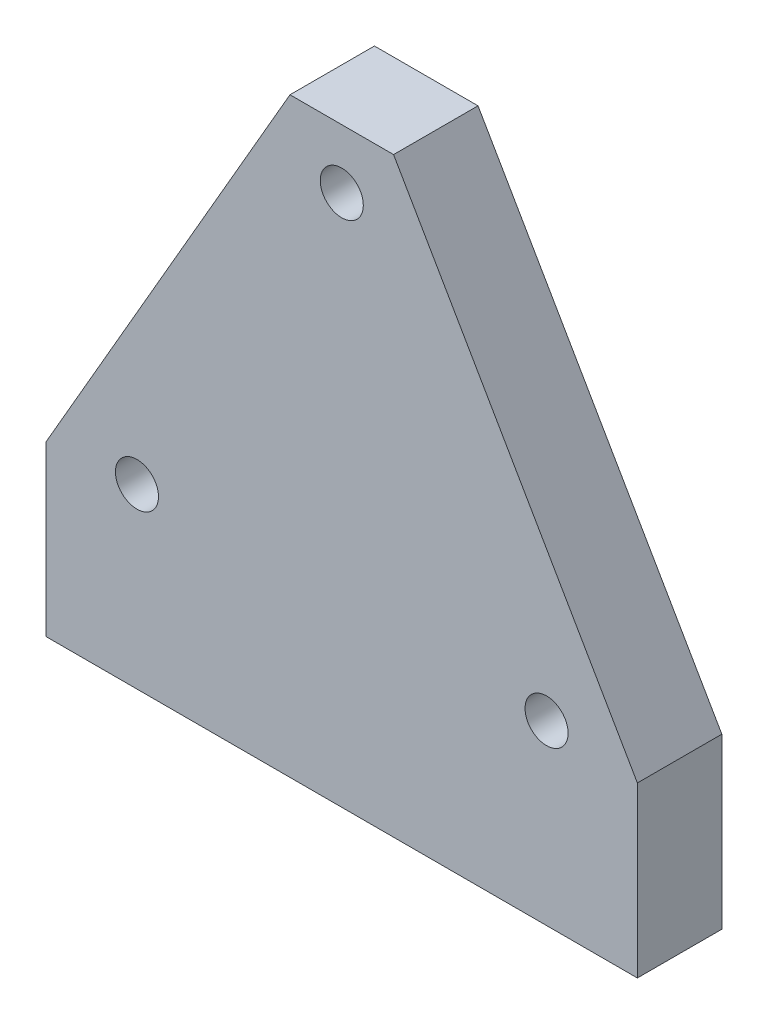
ISO-10303-21;
HEADER;
FILE_DESCRIPTION(('STEP AP214'),'2;1');
FILE_NAME('part.step','',(''),(''),'','','');
FILE_SCHEMA(('AUTOMOTIVE_DESIGN { 1 0 10303 214 1 1 1 1 }'));
ENDSEC;
DATA;
#1=APPLICATION_CONTEXT('core data for automotive mechanical design processes');
#2=APPLICATION_PROTOCOL_DEFINITION('international standard','automotive_design',2000,#1);
#3=PRODUCT_CONTEXT('',#1,'mechanical');
#4=PRODUCT('Part','Part','',(#3));
#5=PRODUCT_RELATED_PRODUCT_CATEGORY('part','',(#4));
#6=PRODUCT_DEFINITION_FORMATION('','',#4);
#7=PRODUCT_DEFINITION_CONTEXT('part definition',#1,'design');
#8=PRODUCT_DEFINITION('design','',#6,#7);
#9=PRODUCT_DEFINITION_SHAPE('','',#8);
#10=(LENGTH_UNIT() NAMED_UNIT(*) SI_UNIT(.MILLI.,.METRE.));
#11=(NAMED_UNIT(*) PLANE_ANGLE_UNIT() SI_UNIT($,.RADIAN.));
#12=(NAMED_UNIT(*) SI_UNIT($,.STERADIAN.) SOLID_ANGLE_UNIT());
#13=UNCERTAINTY_MEASURE_WITH_UNIT(LENGTH_MEASURE(1.E-05),#10,'distance_accuracy_value','');
#14=(GEOMETRIC_REPRESENTATION_CONTEXT(3) GLOBAL_UNCERTAINTY_ASSIGNED_CONTEXT((#13)) GLOBAL_UNIT_ASSIGNED_CONTEXT((#10,
#11,#12)) REPRESENTATION_CONTEXT('',''));
#15=CARTESIAN_POINT('',(0.,0.,0.));
#16=DIRECTION('',(0.,0.,1.));
#17=DIRECTION('',(1.,0.,0.));
#18=AXIS2_PLACEMENT_3D('',#15,#16,#17);
#19=CARTESIAN_POINT('',(0.,0.,10.));
#20=DIRECTION('',(1.,0.,0.));
#21=DIRECTION('',(0.,0.,-1.));
#22=AXIS2_PLACEMENT_3D('',#19,#20,#21);
#23=PLANE('',#22);
#24=DIRECTION('',(0.,-1.,0.));
#25=VECTOR('',#24,1.);
#26=CARTESIAN_POINT('',(0.,0.,10.));
#27=LINE('',#26,#25);
#28=CARTESIAN_POINT('',(0.,19.9999999999997,10.));
#29=VERTEX_POINT('',#28);
#30=CARTESIAN_POINT('',(0.,0.,10.));
#31=VERTEX_POINT('',#30);
#32=EDGE_CURVE('E99',#29,#31,#27,.T.);
#33=ORIENTED_EDGE('',*,*,#32,.F.);
#34=DIRECTION('',(0.,0.,-1.));
#35=VECTOR('',#34,1.);
#36=CARTESIAN_POINT('',(0.,19.9999999999997,10.));
#37=LINE('',#36,#35);
#38=CARTESIAN_POINT('',(0.,19.9999999999997,0.));
#39=VERTEX_POINT('',#38);
#40=EDGE_CURVE('E145',#29,#39,#37,.T.);
#41=ORIENTED_EDGE('',*,*,#40,.T.);
#42=DIRECTION('',(0.,-1.,0.));
#43=VECTOR('',#42,1.);
#44=CARTESIAN_POINT('',(0.,0.,0.));
#45=LINE('',#44,#43);
#46=CARTESIAN_POINT('',(0.,0.,0.));
#47=VERTEX_POINT('',#46);
#48=EDGE_CURVE('E123',#39,#47,#45,.T.);
#49=ORIENTED_EDGE('',*,*,#48,.T.);
#50=DIRECTION('',(0.,0.,-1.));
#51=VECTOR('',#50,1.);
#52=CARTESIAN_POINT('',(0.,0.,10.));
#53=LINE('',#52,#51);
#54=EDGE_CURVE('E116',#31,#47,#53,.T.);
#55=ORIENTED_EDGE('',*,*,#54,.F.);
#56=EDGE_LOOP('',(#33,#41,#49,#55));
#57=FACE_BOUND('',#56,.T.);
#58=ADVANCED_FACE('F45',(#57),#23,.F.);
#59=CARTESIAN_POINT('',(0.,0.,10.));
#60=DIRECTION('',(0.,1.,0.));
#61=DIRECTION('',(0.,0.,1.));
#62=AXIS2_PLACEMENT_3D('',#59,#60,#61);
#63=PLANE('',#62);
#64=DIRECTION('',(1.,0.,0.));
#65=VECTOR('',#64,1.);
#66=CARTESIAN_POINT('',(0.,0.,0.));
#67=LINE('',#66,#65);
#68=CARTESIAN_POINT('',(70.,0.,0.));
#69=VERTEX_POINT('',#68);
#70=EDGE_CURVE('E153',#47,#69,#67,.T.);
#71=ORIENTED_EDGE('',*,*,#70,.T.);
#72=DIRECTION('',(0.,0.,-1.));
#73=VECTOR('',#72,1.);
#74=CARTESIAN_POINT('',(70.,0.,10.));
#75=LINE('',#74,#73);
#76=CARTESIAN_POINT('',(70.,0.,10.));
#77=VERTEX_POINT('',#76);
#78=EDGE_CURVE('E118',#77,#69,#75,.T.);
#79=ORIENTED_EDGE('',*,*,#78,.F.);
#80=DIRECTION('',(1.,0.,0.));
#81=VECTOR('',#80,1.);
#82=CARTESIAN_POINT('',(0.,0.,10.));
#83=LINE('',#82,#81);
#84=EDGE_CURVE('E103',#31,#77,#83,.T.);
#85=ORIENTED_EDGE('',*,*,#84,.F.);
#86=ORIENTED_EDGE('',*,*,#54,.T.);
#87=EDGE_LOOP('',(#71,#79,#85,#86));
#88=FACE_BOUND('',#87,.T.);
#89=ADVANCED_FACE('F115',(#88),#63,.F.);
#90=CARTESIAN_POINT('',(70.,0.,10.));
#91=DIRECTION('',(-1.,0.,0.));
#92=DIRECTION('',(0.,0.,1.));
#93=AXIS2_PLACEMENT_3D('',#90,#91,#92);
#94=PLANE('',#93);
#95=DIRECTION('',(0.,1.,0.));
#96=VECTOR('',#95,1.);
#97=CARTESIAN_POINT('',(70.,0.,0.));
#98=LINE('',#97,#96);
#99=CARTESIAN_POINT('',(70.,19.9999999999997,0.));
#100=VERTEX_POINT('',#99);
#101=EDGE_CURVE('E159',#69,#100,#98,.T.);
#102=ORIENTED_EDGE('',*,*,#101,.T.);
#103=DIRECTION('',(0.,0.,1.));
#104=VECTOR('',#103,1.);
#105=CARTESIAN_POINT('',(70.,19.9999999999997,10.));
#106=LINE('',#105,#104);
#107=CARTESIAN_POINT('',(70.,19.9999999999997,10.));
#108=VERTEX_POINT('',#107);
#109=EDGE_CURVE('E139',#100,#108,#106,.T.);
#110=ORIENTED_EDGE('',*,*,#109,.T.);
#111=DIRECTION('',(0.,1.,0.));
#112=VECTOR('',#111,1.);
#113=CARTESIAN_POINT('',(70.,0.,10.));
#114=LINE('',#113,#112);
#115=EDGE_CURVE('E121',#77,#108,#114,.T.);
#116=ORIENTED_EDGE('',*,*,#115,.F.);
#117=ORIENTED_EDGE('',*,*,#78,.T.);
#118=EDGE_LOOP('',(#102,#110,#116,#117));
#119=FACE_BOUND('',#118,.T.);
#120=ADVANCED_FACE('F184',(#119),#94,.F.);
#121=CARTESIAN_POINT('',(0.,70.,10.));
#122=DIRECTION('',(0.,-1.,0.));
#123=DIRECTION('',(0.,0.,-1.));
#124=AXIS2_PLACEMENT_3D('',#121,#122,#123);
#125=PLANE('',#124);
#126=DIRECTION('',(-1.,0.,0.));
#127=VECTOR('',#126,1.);
#128=CARTESIAN_POINT('',(0.,70.,0.));
#129=LINE('',#128,#127);
#130=CARTESIAN_POINT('',(41.1324865405187,70.,0.));
#131=VERTEX_POINT('',#130);
#132=CARTESIAN_POINT('',(28.8675134594813,70.,0.));
#133=VERTEX_POINT('',#132);
#134=EDGE_CURVE('E111',#131,#133,#129,.T.);
#135=ORIENTED_EDGE('',*,*,#134,.T.);
#136=DIRECTION('',(0.,0.,1.));
#137=VECTOR('',#136,1.);
#138=CARTESIAN_POINT('',(28.8675134594813,70.,10.));
#139=LINE('',#138,#137);
#140=CARTESIAN_POINT('',(28.8675134594813,70.,10.));
#141=VERTEX_POINT('',#140);
#142=EDGE_CURVE('E55',#133,#141,#139,.T.);
#143=ORIENTED_EDGE('',*,*,#142,.T.);
#144=DIRECTION('',(-1.,0.,0.));
#145=VECTOR('',#144,1.);
#146=CARTESIAN_POINT('',(0.,70.,10.));
#147=LINE('',#146,#145);
#148=CARTESIAN_POINT('',(41.1324865405187,70.,10.));
#149=VERTEX_POINT('',#148);
#150=EDGE_CURVE('E133',#149,#141,#147,.T.);
#151=ORIENTED_EDGE('',*,*,#150,.F.);
#152=DIRECTION('',(0.,0.,-1.));
#153=VECTOR('',#152,1.);
#154=CARTESIAN_POINT('',(41.1324865405187,70.,10.));
#155=LINE('',#154,#153);
#156=EDGE_CURVE('E126',#149,#131,#155,.T.);
#157=ORIENTED_EDGE('',*,*,#156,.T.);
#158=EDGE_LOOP('',(#135,#143,#151,#157));
#159=FACE_BOUND('',#158,.T.);
#160=ADVANCED_FACE('F170',(#159),#125,.F.);
#161=CARTESIAN_POINT('',(0.,0.,10.));
#162=DIRECTION('',(0.,0.,-1.));
#163=DIRECTION('',(-1.,0.,0.));
#164=AXIS2_PLACEMENT_3D('',#161,#162,#163);
#165=PLANE('',#164);
#166=CARTESIAN_POINT('',(35.,63.,10.));
#167=DIRECTION('',(0.,0.,1.));
#168=DIRECTION('',(1.,0.,0.));
#169=AXIS2_PLACEMENT_3D('',#166,#167,#168);
#170=CIRCLE('',#169,2.55);
#171=CARTESIAN_POINT('',(37.55,63.,10.));
#172=VERTEX_POINT('',#171);
#173=EDGE_CURVE('E162',#172,#172,#170,.T.);
#174=ORIENTED_EDGE('',*,*,#173,.F.);
#175=EDGE_LOOP('',(#174));
#176=FACE_BOUND('',#175,.T.);
#177=CARTESIAN_POINT('',(59.2487113059654,21.0000000000006,10.));
#178=DIRECTION('',(0.,0.,1.));
#179=DIRECTION('',(1.,0.,0.));
#180=AXIS2_PLACEMENT_3D('',#177,#178,#179);
#181=CIRCLE('',#180,2.55);
#182=CARTESIAN_POINT('',(61.7987113059654,21.0000000000006,10.));
#183=VERTEX_POINT('',#182);
#184=EDGE_CURVE('E220',#183,#183,#181,.T.);
#185=ORIENTED_EDGE('',*,*,#184,.F.);
#186=EDGE_LOOP('',(#185));
#187=FACE_BOUND('',#186,.T.);
#188=CARTESIAN_POINT('',(10.7512886940368,20.9999999999995,10.));
#189=DIRECTION('',(0.,0.,1.));
#190=DIRECTION('',(1.,0.,0.));
#191=AXIS2_PLACEMENT_3D('',#188,#189,#190);
#192=CIRCLE('',#191,2.54999999999999);
#193=CARTESIAN_POINT('',(13.3012886940368,20.9999999999995,10.));
#194=VERTEX_POINT('',#193);
#195=EDGE_CURVE('E230',#194,#194,#192,.T.);
#196=ORIENTED_EDGE('',*,*,#195,.F.);
#197=EDGE_LOOP('',(#196));
#198=FACE_BOUND('',#197,.T.);
#199=ORIENTED_EDGE('',*,*,#150,.T.);
#200=DIRECTION('',(0.499999999999998,0.86602540378444,0.));
#201=VECTOR('',#200,1.);
#202=CARTESIAN_POINT('',(0.,19.9999999999997,10.));
#203=LINE('',#202,#201);
#204=EDGE_CURVE('E11',#141,#29,#203,.F.);
#205=ORIENTED_EDGE('',*,*,#204,.T.);
#206=ORIENTED_EDGE('',*,*,#32,.T.);
#207=ORIENTED_EDGE('',*,*,#84,.T.);
#208=ORIENTED_EDGE('',*,*,#115,.T.);
#209=DIRECTION('',(0.499999999999998,-0.86602540378444,0.));
#210=VECTOR('',#209,1.);
#211=CARTESIAN_POINT('',(41.1324865405187,70.,10.));
#212=LINE('',#211,#210);
#213=EDGE_CURVE('E142',#108,#149,#212,.F.);
#214=ORIENTED_EDGE('',*,*,#213,.T.);
#215=EDGE_LOOP('',(#199,#205,#206,#207,#208,#214));
#216=FACE_BOUND('',#215,.T.);
#217=ADVANCED_FACE('F101',(#176,#187,#198,#216),#165,.F.);
#218=CARTESIAN_POINT('',(0.,0.,0.));
#219=DIRECTION('',(0.,0.,-1.));
#220=DIRECTION('',(-1.,0.,0.));
#221=AXIS2_PLACEMENT_3D('',#218,#219,#220);
#222=PLANE('',#221);
#223=CARTESIAN_POINT('',(35.,63.,0.));
#224=DIRECTION('',(0.,0.,1.));
#225=DIRECTION('',(1.,0.,0.));
#226=AXIS2_PLACEMENT_3D('',#223,#224,#225);
#227=CIRCLE('',#226,2.55);
#228=CARTESIAN_POINT('',(37.55,63.,0.));
#229=VERTEX_POINT('',#228);
#230=EDGE_CURVE('E155',#229,#229,#227,.T.);
#231=ORIENTED_EDGE('',*,*,#230,.T.);
#232=EDGE_LOOP('',(#231));
#233=FACE_BOUND('',#232,.T.);
#234=CARTESIAN_POINT('',(59.2487113059654,21.0000000000006,0.));
#235=DIRECTION('',(0.,0.,1.));
#236=DIRECTION('',(1.,0.,0.));
#237=AXIS2_PLACEMENT_3D('',#234,#235,#236);
#238=CIRCLE('',#237,2.55);
#239=CARTESIAN_POINT('',(61.7987113059654,21.0000000000006,0.));
#240=VERTEX_POINT('',#239);
#241=EDGE_CURVE('E224',#240,#240,#238,.T.);
#242=ORIENTED_EDGE('',*,*,#241,.T.);
#243=EDGE_LOOP('',(#242));
#244=FACE_BOUND('',#243,.T.);
#245=CARTESIAN_POINT('',(10.7512886940368,20.9999999999995,0.));
#246=DIRECTION('',(0.,0.,1.));
#247=DIRECTION('',(1.,0.,0.));
#248=AXIS2_PLACEMENT_3D('',#245,#246,#247);
#249=CIRCLE('',#248,2.54999999999999);
#250=CARTESIAN_POINT('',(13.3012886940368,20.9999999999995,0.));
#251=VERTEX_POINT('',#250);
#252=EDGE_CURVE('E234',#251,#251,#249,.T.);
#253=ORIENTED_EDGE('',*,*,#252,.T.);
#254=EDGE_LOOP('',(#253));
#255=FACE_BOUND('',#254,.T.);
#256=ORIENTED_EDGE('',*,*,#48,.F.);
#257=DIRECTION('',(-0.499999999999998,-0.86602540378444,0.));
#258=VECTOR('',#257,1.);
#259=CARTESIAN_POINT('',(-8.66025403784424,4.99999999999989,0.));
#260=LINE('',#259,#258);
#261=EDGE_CURVE('E69',#39,#133,#260,.F.);
#262=ORIENTED_EDGE('',*,*,#261,.T.);
#263=ORIENTED_EDGE('',*,*,#134,.F.);
#264=DIRECTION('',(-0.499999999999998,0.86602540378444,0.));
#265=VECTOR('',#264,1.);
#266=CARTESIAN_POINT('',(61.1602540378444,35.3108891324552,0.));
#267=LINE('',#266,#265);
#268=EDGE_CURVE('E131',#131,#100,#267,.F.);
#269=ORIENTED_EDGE('',*,*,#268,.T.);
#270=ORIENTED_EDGE('',*,*,#101,.F.);
#271=ORIENTED_EDGE('',*,*,#70,.F.);
#272=EDGE_LOOP('',(#256,#262,#263,#269,#270,#271));
#273=FACE_BOUND('',#272,.T.);
#274=ADVANCED_FACE('F151',(#233,#244,#255,#273),#222,.T.);
#275=CARTESIAN_POINT('',(10.7512886940368,20.9999999999995,0.));
#276=DIRECTION('',(0.,0.,1.));
#277=DIRECTION('',(1.,0.,0.));
#278=AXIS2_PLACEMENT_3D('',#275,#276,#277);
#279=CYLINDRICAL_SURFACE('',#278,2.54999999999999);
#280=ORIENTED_EDGE('',*,*,#252,.F.);
#281=EDGE_LOOP('',(#280));
#282=FACE_BOUND('',#281,.T.);
#283=ORIENTED_EDGE('',*,*,#195,.T.);
#284=EDGE_LOOP('',(#283));
#285=FACE_BOUND('',#284,.T.);
#286=ADVANCED_FACE('F199',(#282,#285),#279,.F.);
#287=CARTESIAN_POINT('',(59.2487113059654,21.0000000000006,0.));
#288=DIRECTION('',(0.,0.,1.));
#289=DIRECTION('',(1.,0.,0.));
#290=AXIS2_PLACEMENT_3D('',#287,#288,#289);
#291=CYLINDRICAL_SURFACE('',#290,2.55);
#292=ORIENTED_EDGE('',*,*,#241,.F.);
#293=EDGE_LOOP('',(#292));
#294=FACE_BOUND('',#293,.T.);
#295=ORIENTED_EDGE('',*,*,#184,.T.);
#296=EDGE_LOOP('',(#295));
#297=FACE_BOUND('',#296,.T.);
#298=ADVANCED_FACE('F206',(#294,#297),#291,.F.);
#299=CARTESIAN_POINT('',(35.,63.,0.));
#300=DIRECTION('',(0.,0.,1.));
#301=DIRECTION('',(1.,0.,0.));
#302=AXIS2_PLACEMENT_3D('',#299,#300,#301);
#303=CYLINDRICAL_SURFACE('',#302,2.55);
#304=ORIENTED_EDGE('',*,*,#230,.F.);
#305=EDGE_LOOP('',(#304));
#306=FACE_BOUND('',#305,.T.);
#307=ORIENTED_EDGE('',*,*,#173,.T.);
#308=EDGE_LOOP('',(#307));
#309=FACE_BOUND('',#308,.T.);
#310=ADVANCED_FACE('F177',(#306,#309),#303,.F.);
#311=CARTESIAN_POINT('',(41.1324865405187,70.,10.));
#312=DIRECTION('',(-0.86602540378444,-0.499999999999998,0.));
#313=DIRECTION('',(0.,0.,-1.));
#314=AXIS2_PLACEMENT_3D('',#311,#312,#313);
#315=PLANE('',#314);
#316=ORIENTED_EDGE('',*,*,#213,.F.);
#317=ORIENTED_EDGE('',*,*,#109,.F.);
#318=ORIENTED_EDGE('',*,*,#268,.F.);
#319=ORIENTED_EDGE('',*,*,#156,.F.);
#320=EDGE_LOOP('',(#316,#317,#318,#319));
#321=FACE_BOUND('',#320,.T.);
#322=ADVANCED_FACE('F173',(#321),#315,.F.);
#323=CARTESIAN_POINT('',(0.,19.9999999999997,10.));
#324=DIRECTION('',(0.86602540378444,-0.499999999999998,0.));
#325=DIRECTION('',(0.,0.,-1.));
#326=AXIS2_PLACEMENT_3D('',#323,#324,#325);
#327=PLANE('',#326);
#328=ORIENTED_EDGE('',*,*,#204,.F.);
#329=ORIENTED_EDGE('',*,*,#142,.F.);
#330=ORIENTED_EDGE('',*,*,#261,.F.);
#331=ORIENTED_EDGE('',*,*,#40,.F.);
#332=EDGE_LOOP('',(#328,#329,#330,#331));
#333=FACE_BOUND('',#332,.T.);
#334=ADVANCED_FACE('F48',(#333),#327,.F.);
#335=CLOSED_SHELL('',(#58,#89,#120,#160,#217,#274,#286,#298,#310,#322,#334));
#336=MANIFOLD_SOLID_BREP('B2',#335);
#337=ADVANCED_BREP_SHAPE_REPRESENTATION('',(#18,#336),#14);
#338=SHAPE_DEFINITION_REPRESENTATION(#9,#337);
ENDSEC;
END-ISO-10303-21;
